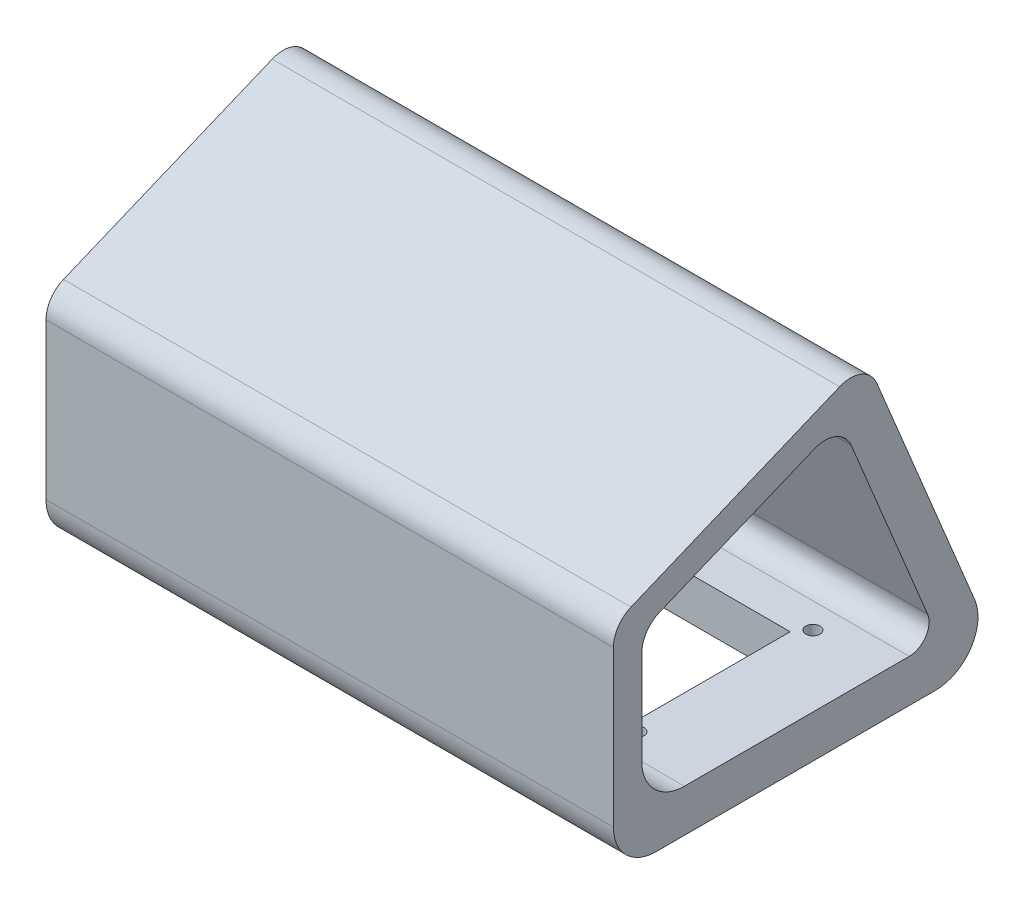
ISO-10303-21;
HEADER;
FILE_DESCRIPTION(('STEP AP214'),'2;1');
FILE_NAME('part.step','',(''),(''),'','','');
FILE_SCHEMA(('AUTOMOTIVE_DESIGN { 1 0 10303 214 1 1 1 1 }'));
ENDSEC;
DATA;
#1=APPLICATION_CONTEXT('core data for automotive mechanical design processes');
#2=APPLICATION_PROTOCOL_DEFINITION('international standard','automotive_design',2000,#1);
#3=PRODUCT_CONTEXT('',#1,'mechanical');
#4=PRODUCT('Part','Part','',(#3));
#5=PRODUCT_RELATED_PRODUCT_CATEGORY('part','',(#4));
#6=PRODUCT_DEFINITION_FORMATION('','',#4);
#7=PRODUCT_DEFINITION_CONTEXT('part definition',#1,'design');
#8=PRODUCT_DEFINITION('design','',#6,#7);
#9=PRODUCT_DEFINITION_SHAPE('','',#8);
#10=(LENGTH_UNIT() NAMED_UNIT(*) SI_UNIT(.MILLI.,.METRE.));
#11=(NAMED_UNIT(*) PLANE_ANGLE_UNIT() SI_UNIT($,.RADIAN.));
#12=(NAMED_UNIT(*) SI_UNIT($,.STERADIAN.) SOLID_ANGLE_UNIT());
#13=UNCERTAINTY_MEASURE_WITH_UNIT(LENGTH_MEASURE(1.E-05),#10,'distance_accuracy_value','');
#14=(GEOMETRIC_REPRESENTATION_CONTEXT(3) GLOBAL_UNCERTAINTY_ASSIGNED_CONTEXT((#13)) GLOBAL_UNIT_ASSIGNED_CONTEXT((#10,
#11,#12)) REPRESENTATION_CONTEXT('',''));
#15=CARTESIAN_POINT('',(0.,0.,0.));
#16=DIRECTION('',(0.,0.,1.));
#17=DIRECTION('',(1.,0.,0.));
#18=AXIS2_PLACEMENT_3D('',#15,#16,#17);
#19=CARTESIAN_POINT('',(-37.5,7.5,15.499999988));
#20=DIRECTION('',(0.,-1.,0.));
#21=DIRECTION('',(0.,0.,1.));
#22=AXIS2_PLACEMENT_3D('',#19,#20,#21);
#23=CYLINDRICAL_SURFACE('',#22,1.2499975);
#24=CARTESIAN_POINT('',(-37.5,7.5,15.499999988));
#25=DIRECTION('',(0.,-1.,0.));
#26=DIRECTION('',(0.,0.,-1.));
#27=AXIS2_PLACEMENT_3D('',#24,#25,#26);
#28=CIRCLE('',#27,1.2499975);
#29=CARTESIAN_POINT('',(-37.5,7.5,14.250002488));
#30=VERTEX_POINT('',#29);
#31=EDGE_CURVE('E239',#30,#30,#28,.T.);
#32=ORIENTED_EDGE('',*,*,#31,.F.);
#33=EDGE_LOOP('',(#32));
#34=FACE_BOUND('',#33,.T.);
#35=CARTESIAN_POINT('',(-37.5,0.,15.499999988));
#36=DIRECTION('',(0.,-1.,0.));
#37=DIRECTION('',(0.,0.,-1.));
#38=AXIS2_PLACEMENT_3D('',#35,#36,#37);
#39=CIRCLE('',#38,1.2499975);
#40=CARTESIAN_POINT('',(-37.5,0.,14.250002488));
#41=VERTEX_POINT('',#40);
#42=EDGE_CURVE('E242',#41,#41,#39,.T.);
#43=ORIENTED_EDGE('',*,*,#42,.T.);
#44=EDGE_LOOP('',(#43));
#45=FACE_BOUND('',#44,.T.);
#46=ADVANCED_FACE('F34',(#34,#45),#23,.F.);
#47=CARTESIAN_POINT('',(37.5,7.5,15.499999988));
#48=DIRECTION('',(0.,-1.,0.));
#49=DIRECTION('',(0.,0.,1.));
#50=AXIS2_PLACEMENT_3D('',#47,#48,#49);
#51=CYLINDRICAL_SURFACE('',#50,1.2499975);
#52=CARTESIAN_POINT('',(37.5,7.5,15.499999988));
#53=DIRECTION('',(0.,1.,0.));
#54=DIRECTION('',(0.,0.,-1.));
#55=AXIS2_PLACEMENT_3D('',#52,#53,#54);
#56=CIRCLE('',#55,1.2499975);
#57=CARTESIAN_POINT('',(37.5,7.5,14.250002488));
#58=VERTEX_POINT('',#57);
#59=EDGE_CURVE('E233',#58,#58,#56,.T.);
#60=ORIENTED_EDGE('',*,*,#59,.T.);
#61=EDGE_LOOP('',(#60));
#62=FACE_BOUND('',#61,.T.);
#63=CARTESIAN_POINT('',(37.5,0.,15.499999988));
#64=DIRECTION('',(0.,1.,0.));
#65=DIRECTION('',(0.,0.,-1.));
#66=AXIS2_PLACEMENT_3D('',#63,#64,#65);
#67=CIRCLE('',#66,1.2499975);
#68=CARTESIAN_POINT('',(37.5,0.,14.250002488));
#69=VERTEX_POINT('',#68);
#70=EDGE_CURVE('E236',#69,#69,#67,.T.);
#71=ORIENTED_EDGE('',*,*,#70,.F.);
#72=EDGE_LOOP('',(#71));
#73=FACE_BOUND('',#72,.T.);
#74=ADVANCED_FACE('F385',(#62,#73),#51,.F.);
#75=CARTESIAN_POINT('',(37.5,7.5,-15.499999988));
#76=DIRECTION('',(0.,-1.,0.));
#77=DIRECTION('',(0.,0.,-1.));
#78=AXIS2_PLACEMENT_3D('',#75,#76,#77);
#79=CYLINDRICAL_SURFACE('',#78,1.2499975);
#80=CARTESIAN_POINT('',(37.5,7.5,-15.499999988));
#81=DIRECTION('',(0.,-1.,0.));
#82=DIRECTION('',(0.,0.,1.));
#83=AXIS2_PLACEMENT_3D('',#80,#81,#82);
#84=CIRCLE('',#83,1.2499975);
#85=CARTESIAN_POINT('',(37.5,7.5,-14.250002488));
#86=VERTEX_POINT('',#85);
#87=EDGE_CURVE('E224',#86,#86,#84,.T.);
#88=ORIENTED_EDGE('',*,*,#87,.F.);
#89=EDGE_LOOP('',(#88));
#90=FACE_BOUND('',#89,.T.);
#91=CARTESIAN_POINT('',(37.5,0.,-15.499999988));
#92=DIRECTION('',(0.,-1.,0.));
#93=DIRECTION('',(0.,0.,1.));
#94=AXIS2_PLACEMENT_3D('',#91,#92,#93);
#95=CIRCLE('',#94,1.2499975);
#96=CARTESIAN_POINT('',(37.5,0.,-14.250002488));
#97=VERTEX_POINT('',#96);
#98=EDGE_CURVE('E230',#97,#97,#95,.T.);
#99=ORIENTED_EDGE('',*,*,#98,.T.);
#100=EDGE_LOOP('',(#99));
#101=FACE_BOUND('',#100,.T.);
#102=ADVANCED_FACE('F391',(#90,#101),#79,.F.);
#103=CARTESIAN_POINT('',(0.,7.5,0.));
#104=DIRECTION('',(0.,1.,0.));
#105=DIRECTION('',(0.,0.,1.));
#106=AXIS2_PLACEMENT_3D('',#103,#104,#105);
#107=PLANE('',#106);
#108=DIRECTION('',(0.,0.,1.));
#109=VECTOR('',#108,1.);
#110=CARTESIAN_POINT('',(-50.,7.5,-32.717510921475));
#111=LINE('',#110,#109);
#112=CARTESIAN_POINT('',(-50.,7.5,-19.9793907521458));
#113=VERTEX_POINT('',#112);
#114=CARTESIAN_POINT('',(-50.,7.5,19.6460132044939));
#115=VERTEX_POINT('',#114);
#116=EDGE_CURVE('E220',#113,#115,#111,.T.);
#117=ORIENTED_EDGE('',*,*,#116,.T.);
#118=DIRECTION('',(1.,0.,0.));
#119=VECTOR('',#118,1.);
#120=CARTESIAN_POINT('',(50.,7.5,19.6460132044939));
#121=LINE('',#120,#119);
#122=CARTESIAN_POINT('',(50.,7.5,19.6460132044939));
#123=VERTEX_POINT('',#122);
#124=EDGE_CURVE('E265',#115,#123,#121,.T.);
#125=ORIENTED_EDGE('',*,*,#124,.T.);
#126=DIRECTION('',(0.,0.,-1.));
#127=VECTOR('',#126,1.);
#128=CARTESIAN_POINT('',(50.,7.5,-32.717510921475));
#129=LINE('',#128,#127);
#130=CARTESIAN_POINT('',(50.,7.5,-19.9793907521458));
#131=VERTEX_POINT('',#130);
#132=EDGE_CURVE('E218',#123,#131,#129,.T.);
#133=ORIENTED_EDGE('',*,*,#132,.T.);
#134=DIRECTION('',(1.,0.,0.));
#135=VECTOR('',#134,1.);
#136=CARTESIAN_POINT('',(-50.,7.5,-19.9793907521458));
#137=LINE('',#136,#135);
#138=EDGE_CURVE('E258',#131,#113,#137,.F.);
#139=ORIENTED_EDGE('',*,*,#138,.T.);
#140=EDGE_LOOP('',(#117,#125,#133,#139));
#141=FACE_BOUND('',#140,.T.);
#142=ORIENTED_EDGE('',*,*,#31,.T.);
#143=EDGE_LOOP('',(#142));
#144=FACE_BOUND('',#143,.T.);
#145=ORIENTED_EDGE('',*,*,#59,.F.);
#146=EDGE_LOOP('',(#145));
#147=FACE_BOUND('',#146,.T.);
#148=ORIENTED_EDGE('',*,*,#87,.T.);
#149=EDGE_LOOP('',(#148));
#150=FACE_BOUND('',#149,.T.);
#151=DIRECTION('',(-1.,0.,0.));
#152=VECTOR('',#151,1.);
#153=CARTESIAN_POINT('',(-35.75,7.5,-13.25));
#154=LINE('',#153,#152);
#155=CARTESIAN_POINT('',(35.75,7.5,-13.25));
#156=VERTEX_POINT('',#155);
#157=CARTESIAN_POINT('',(-35.75,7.5,-13.25));
#158=VERTEX_POINT('',#157);
#159=EDGE_CURVE('E183',#156,#158,#154,.T.);
#160=ORIENTED_EDGE('',*,*,#159,.F.);
#161=DIRECTION('',(0.,0.,-1.));
#162=VECTOR('',#161,1.);
#163=CARTESIAN_POINT('',(35.75,7.5,-13.25));
#164=LINE('',#163,#162);
#165=CARTESIAN_POINT('',(35.75,7.5,13.25));
#166=VERTEX_POINT('',#165);
#167=EDGE_CURVE('E173',#166,#156,#164,.T.);
#168=ORIENTED_EDGE('',*,*,#167,.F.);
#169=DIRECTION('',(1.,0.,0.));
#170=VECTOR('',#169,1.);
#171=CARTESIAN_POINT('',(-35.75,7.5,13.25));
#172=LINE('',#171,#170);
#173=CARTESIAN_POINT('',(-35.75,7.5,13.25));
#174=VERTEX_POINT('',#173);
#175=EDGE_CURVE('E200',#174,#166,#172,.T.);
#176=ORIENTED_EDGE('',*,*,#175,.F.);
#177=DIRECTION('',(0.,0.,1.));
#178=VECTOR('',#177,1.);
#179=CARTESIAN_POINT('',(-35.75,7.5,-13.25));
#180=LINE('',#179,#178);
#181=EDGE_CURVE('E198',#158,#174,#180,.T.);
#182=ORIENTED_EDGE('',*,*,#181,.F.);
#183=EDGE_LOOP('',(#160,#168,#176,#182));
#184=FACE_BOUND('',#183,.T.);
#185=CARTESIAN_POINT('',(-37.5,7.5,-15.499999988));
#186=DIRECTION('',(0.,1.,0.));
#187=DIRECTION('',(0.,0.,1.));
#188=AXIS2_PLACEMENT_3D('',#185,#186,#187);
#189=CIRCLE('',#188,1.2499975);
#190=CARTESIAN_POINT('',(-37.5,7.5,-14.250002488));
#191=VERTEX_POINT('',#190);
#192=EDGE_CURVE('E207',#191,#191,#189,.T.);
#193=ORIENTED_EDGE('',*,*,#192,.F.);
#194=EDGE_LOOP('',(#193));
#195=FACE_BOUND('',#194,.T.);
#196=ADVANCED_FACE('F195',(#141,#144,#147,#150,#184,#195),#107,.T.);
#197=CARTESIAN_POINT('',(0.,0.,0.));
#198=DIRECTION('',(0.,1.,0.));
#199=DIRECTION('',(0.,0.,1.));
#200=AXIS2_PLACEMENT_3D('',#197,#198,#199);
#201=PLANE('',#200);
#202=ORIENTED_EDGE('',*,*,#42,.F.);
#203=EDGE_LOOP('',(#202));
#204=FACE_BOUND('',#203,.T.);
#205=ORIENTED_EDGE('',*,*,#70,.T.);
#206=EDGE_LOOP('',(#205));
#207=FACE_BOUND('',#206,.T.);
#208=ORIENTED_EDGE('',*,*,#98,.F.);
#209=EDGE_LOOP('',(#208));
#210=FACE_BOUND('',#209,.T.);
#211=DIRECTION('',(0.,0.,-1.));
#212=VECTOR('',#211,1.);
#213=CARTESIAN_POINT('',(50.,0.,-32.717510921475));
#214=LINE('',#213,#212);
#215=CARTESIAN_POINT('',(50.,0.,24.6460132044939));
#216=VERTEX_POINT('',#215);
#217=CARTESIAN_POINT('',(50.,0.,-24.599569419282));
#218=VERTEX_POINT('',#217);
#219=EDGE_CURVE('E191',#216,#218,#214,.T.);
#220=ORIENTED_EDGE('',*,*,#219,.F.);
#221=DIRECTION('',(1.,0.,0.));
#222=VECTOR('',#221,1.);
#223=CARTESIAN_POINT('',(-50.,0.,24.6460132044939));
#224=LINE('',#223,#222);
#225=CARTESIAN_POINT('',(-50.,0.,24.6460132044939));
#226=VERTEX_POINT('',#225);
#227=EDGE_CURVE('E276',#216,#226,#224,.F.);
#228=ORIENTED_EDGE('',*,*,#227,.T.);
#229=DIRECTION('',(0.,0.,1.));
#230=VECTOR('',#229,1.);
#231=CARTESIAN_POINT('',(-50.,0.,-32.717510921475));
#232=LINE('',#231,#230);
#233=CARTESIAN_POINT('',(-50.,0.,-24.599569419282));
#234=VERTEX_POINT('',#233);
#235=EDGE_CURVE('E221',#234,#226,#232,.T.);
#236=ORIENTED_EDGE('',*,*,#235,.F.);
#237=DIRECTION('',(1.,0.,0.));
#238=VECTOR('',#237,1.);
#239=CARTESIAN_POINT('',(50.,0.,-24.599569419282));
#240=LINE('',#239,#238);
#241=EDGE_CURVE('E245',#234,#218,#240,.T.);
#242=ORIENTED_EDGE('',*,*,#241,.T.);
#243=EDGE_LOOP('',(#220,#228,#236,#242));
#244=FACE_BOUND('',#243,.T.);
#245=DIRECTION('',(0.,0.,-1.));
#246=VECTOR('',#245,1.);
#247=CARTESIAN_POINT('',(35.75,0.,-13.25));
#248=LINE('',#247,#246);
#249=CARTESIAN_POINT('',(35.75,0.,13.25));
#250=VERTEX_POINT('',#249);
#251=CARTESIAN_POINT('',(35.75,0.,-13.25));
#252=VERTEX_POINT('',#251);
#253=EDGE_CURVE('E205',#250,#252,#248,.T.);
#254=ORIENTED_EDGE('',*,*,#253,.T.);
#255=DIRECTION('',(-1.,0.,0.));
#256=VECTOR('',#255,1.);
#257=CARTESIAN_POINT('',(-35.75,0.,-13.25));
#258=LINE('',#257,#256);
#259=CARTESIAN_POINT('',(-35.75,0.,-13.25));
#260=VERTEX_POINT('',#259);
#261=EDGE_CURVE('E190',#252,#260,#258,.T.);
#262=ORIENTED_EDGE('',*,*,#261,.T.);
#263=DIRECTION('',(0.,0.,1.));
#264=VECTOR('',#263,1.);
#265=CARTESIAN_POINT('',(-35.75,0.,-13.25));
#266=LINE('',#265,#264);
#267=CARTESIAN_POINT('',(-35.75,0.,13.25));
#268=VERTEX_POINT('',#267);
#269=EDGE_CURVE('E209',#260,#268,#266,.T.);
#270=ORIENTED_EDGE('',*,*,#269,.T.);
#271=DIRECTION('',(1.,0.,0.));
#272=VECTOR('',#271,1.);
#273=CARTESIAN_POINT('',(-35.75,0.,13.25));
#274=LINE('',#273,#272);
#275=EDGE_CURVE('E184',#268,#250,#274,.T.);
#276=ORIENTED_EDGE('',*,*,#275,.T.);
#277=EDGE_LOOP('',(#254,#262,#270,#276));
#278=FACE_BOUND('',#277,.T.);
#279=CARTESIAN_POINT('',(-37.5,0.,-15.499999988));
#280=DIRECTION('',(0.,1.,0.));
#281=DIRECTION('',(0.,0.,1.));
#282=AXIS2_PLACEMENT_3D('',#279,#280,#281);
#283=CIRCLE('',#282,1.2499975);
#284=CARTESIAN_POINT('',(-37.5,0.,-14.250002488));
#285=VERTEX_POINT('',#284);
#286=EDGE_CURVE('E361',#285,#285,#283,.T.);
#287=ORIENTED_EDGE('',*,*,#286,.T.);
#288=EDGE_LOOP('',(#287));
#289=FACE_BOUND('',#288,.T.);
#290=ADVANCED_FACE('F366',(#204,#207,#210,#244,#278,#289),#201,.F.);
#291=CARTESIAN_POINT('',(50.,7.5,-32.717510921475));
#292=DIRECTION('',(-1.,0.,0.));
#293=DIRECTION('',(0.,0.,1.));
#294=AXIS2_PLACEMENT_3D('',#291,#292,#293);
#295=PLANE('',#294);
#296=DIRECTION('',(0.,0.382683432365094,-0.923879532511285));
#297=VECTOR('',#296,1.);
#298=CARTESIAN_POINT('',(50.,34.934018325252,27.1460132044939));
#299=LINE('',#298,#297);
#300=CARTESIAN_POINT('',(50.,36.2125227982119,24.0594303663194));
#301=VERTEX_POINT('',#300);
#302=CARTESIAN_POINT('',(50.,47.5162836954404,-3.23026249759205));
#303=VERTEX_POINT('',#302);
#304=EDGE_CURVE('E320',#301,#303,#299,.T.);
#305=ORIENTED_EDGE('',*,*,#304,.T.);
#306=CARTESIAN_POINT('',(50.,42.896886032884,-5.14367965941751));
#307=DIRECTION('',(-1.,0.,0.));
#308=DIRECTION('',(0.,0.,1.));
#309=AXIS2_PLACEMENT_3D('',#306,#307,#308);
#310=CIRCLE('',#309,5.);
#311=CARTESIAN_POINT('',(50.,44.8103031947095,-9.76307732197394));
#312=VERTEX_POINT('',#311);
#313=EDGE_CURVE('E311',#303,#312,#310,.T.);
#314=ORIENTED_EDGE('',*,*,#313,.T.);
#315=DIRECTION('',(0.,-0.923879532511285,-0.382683432365094));
#316=VECTOR('',#315,1.);
#317=CARTESIAN_POINT('',(50.,0.,-28.3241126392733));
#318=LINE('',#317,#316);
#319=CARTESIAN_POINT('',(50.,12.3393920132778,-23.2129691159353));
#320=VERTEX_POINT('',#319);
#321=EDGE_CURVE('E356',#312,#320,#318,.T.);
#322=ORIENTED_EDGE('',*,*,#321,.T.);
#323=CARTESIAN_POINT('',(50.,11.,-19.9793907521458));
#324=DIRECTION('',(-1.,0.,0.));
#325=DIRECTION('',(0.,0.,1.));
#326=AXIS2_PLACEMENT_3D('',#323,#324,#325);
#327=CIRCLE('',#326,3.5);
#328=EDGE_CURVE('E260',#320,#131,#327,.T.);
#329=ORIENTED_EDGE('',*,*,#328,.T.);
#330=ORIENTED_EDGE('',*,*,#132,.F.);
#331=CARTESIAN_POINT('',(50.,15.,19.6460132044939));
#332=DIRECTION('',(-1.,0.,0.));
#333=DIRECTION('',(0.,0.,1.));
#334=AXIS2_PLACEMENT_3D('',#331,#332,#333);
#335=CIRCLE('',#334,7.5);
#336=CARTESIAN_POINT('',(50.,15.,27.1460132044939));
#337=VERTEX_POINT('',#336);
#338=EDGE_CURVE('E280',#123,#337,#335,.T.);
#339=ORIENTED_EDGE('',*,*,#338,.T.);
#340=DIRECTION('',(0.,1.,0.));
#341=VECTOR('',#340,1.);
#342=CARTESIAN_POINT('',(50.,0.,27.1460132044939));
#343=LINE('',#342,#341);
#344=CARTESIAN_POINT('',(50.,31.5931251356555,27.1460132044939));
#345=VERTEX_POINT('',#344);
#346=EDGE_CURVE('E322',#337,#345,#343,.T.);
#347=ORIENTED_EDGE('',*,*,#346,.T.);
#348=CARTESIAN_POINT('',(50.,31.5931251356555,22.1460132044939));
#349=DIRECTION('',(-1.,0.,0.));
#350=DIRECTION('',(0.,0.,1.));
#351=AXIS2_PLACEMENT_3D('',#348,#349,#350);
#352=CIRCLE('',#351,5.);
#353=EDGE_CURVE('E42',#345,#301,#352,.T.);
#354=ORIENTED_EDGE('',*,*,#353,.T.);
#355=EDGE_LOOP('',(#305,#314,#322,#329,#330,#339,#347,#354));
#356=FACE_BOUND('',#355,.T.);
#357=DIRECTION('',(0.,0.923879532511285,0.382683432365094));
#358=VECTOR('',#357,1.);
#359=CARTESIAN_POINT('',(50.,7.5,-32.717510921475));
#360=LINE('',#359,#358);
#361=CARTESIAN_POINT('',(50.,10.3701257427382,-31.5286659131167));
#362=VERTEX_POINT('',#361);
#363=CARTESIAN_POINT('',(50.,52.0813512867155,-14.251310589598));
#364=VERTEX_POINT('',#363);
#365=EDGE_CURVE('E341',#362,#364,#360,.T.);
#366=ORIENTED_EDGE('',*,*,#365,.T.);
#367=CARTESIAN_POINT('',(50.,50.16793412489,-9.63191292704158));
#368=DIRECTION('',(-1.,0.,0.));
#369=DIRECTION('',(0.,0.,1.));
#370=AXIS2_PLACEMENT_3D('',#367,#368,#369);
#371=CIRCLE('',#370,5.);
#372=CARTESIAN_POINT('',(50.,54.7873317874464,-7.71849576521613));
#373=VERTEX_POINT('',#372);
#374=EDGE_CURVE('E296',#364,#373,#371,.F.);
#375=ORIENTED_EDGE('',*,*,#374,.T.);
#376=DIRECTION('',(0.,-0.382683432365094,0.923879532511285));
#377=VECTOR('',#376,1.);
#378=CARTESIAN_POINT('',(50.,38.2749115148484,32.1460132044939));
#379=LINE('',#378,#377);
#380=CARTESIAN_POINT('',(50.,39.5534159878084,29.0594303663194));
#381=VERTEX_POINT('',#380);
#382=EDGE_CURVE('E330',#373,#381,#379,.T.);
#383=ORIENTED_EDGE('',*,*,#382,.T.);
#384=CARTESIAN_POINT('',(50.,34.934018325252,27.1460132044939));
#385=DIRECTION('',(-1.,0.,0.));
#386=DIRECTION('',(0.,0.,1.));
#387=AXIS2_PLACEMENT_3D('',#384,#385,#386);
#388=CIRCLE('',#387,5.);
#389=CARTESIAN_POINT('',(50.,34.934018325252,32.1460132044939));
#390=VERTEX_POINT('',#389);
#391=EDGE_CURVE('E294',#381,#390,#388,.F.);
#392=ORIENTED_EDGE('',*,*,#391,.T.);
#393=DIRECTION('',(0.,-1.,0.));
#394=VECTOR('',#393,1.);
#395=CARTESIAN_POINT('',(50.,0.,32.1460132044939));
#396=LINE('',#395,#394);
#397=CARTESIAN_POINT('',(50.,7.5,32.1460132044939));
#398=VERTEX_POINT('',#397);
#399=EDGE_CURVE('E350',#390,#398,#396,.T.);
#400=ORIENTED_EDGE('',*,*,#399,.T.);
#401=CARTESIAN_POINT('',(50.,7.5,24.6460132044939));
#402=DIRECTION('',(-1.,0.,0.));
#403=DIRECTION('',(0.,0.,1.));
#404=AXIS2_PLACEMENT_3D('',#401,#402,#403);
#405=CIRCLE('',#404,7.5);
#406=EDGE_CURVE('E274',#398,#216,#405,.F.);
#407=ORIENTED_EDGE('',*,*,#406,.T.);
#408=ORIENTED_EDGE('',*,*,#219,.T.);
#409=CARTESIAN_POINT('',(50.,7.5,-24.599569419282));
#410=DIRECTION('',(-1.,0.,0.));
#411=DIRECTION('',(0.,0.,1.));
#412=AXIS2_PLACEMENT_3D('',#409,#410,#411);
#413=CIRCLE('',#412,7.5);
#414=EDGE_CURVE('E248',#218,#362,#413,.F.);
#415=ORIENTED_EDGE('',*,*,#414,.T.);
#416=EDGE_LOOP('',(#366,#375,#383,#392,#400,#407,#408,#415));
#417=FACE_BOUND('',#416,.T.);
#418=ADVANCED_FACE('F318',(#356,#417),#295,.F.);
#419=CARTESIAN_POINT('',(-50.,7.5,-32.717510921475));
#420=DIRECTION('',(1.,0.,0.));
#421=DIRECTION('',(0.,0.,-1.));
#422=AXIS2_PLACEMENT_3D('',#419,#420,#421);
#423=PLANE('',#422);
#424=DIRECTION('',(0.,0.382683432365094,-0.923879532511285));
#425=VECTOR('',#424,1.);
#426=CARTESIAN_POINT('',(-50.,38.2749115148485,32.1460132044939));
#427=LINE('',#426,#425);
#428=CARTESIAN_POINT('',(-50.,39.5534159878084,29.0594303663194));
#429=VERTEX_POINT('',#428);
#430=CARTESIAN_POINT('',(-50.,54.7873317874464,-7.71849576521613));
#431=VERTEX_POINT('',#430);
#432=EDGE_CURVE('E343',#429,#431,#427,.T.);
#433=ORIENTED_EDGE('',*,*,#432,.T.);
#434=CARTESIAN_POINT('',(-50.,50.16793412489,-9.63191292704158));
#435=DIRECTION('',(1.,0.,0.));
#436=DIRECTION('',(0.,0.,-1.));
#437=AXIS2_PLACEMENT_3D('',#434,#435,#436);
#438=CIRCLE('',#437,5.);
#439=CARTESIAN_POINT('',(-50.,52.0813512867155,-14.251310589598));
#440=VERTEX_POINT('',#439);
#441=EDGE_CURVE('E305',#431,#440,#438,.F.);
#442=ORIENTED_EDGE('',*,*,#441,.T.);
#443=DIRECTION('',(0.,-0.923879532511285,-0.382683432365094));
#444=VECTOR('',#443,1.);
#445=CARTESIAN_POINT('',(-50.,7.5,-32.717510921475));
#446=LINE('',#445,#444);
#447=CARTESIAN_POINT('',(-50.,10.3701257427382,-31.5286659131167));
#448=VERTEX_POINT('',#447);
#449=EDGE_CURVE('E355',#440,#448,#446,.T.);
#450=ORIENTED_EDGE('',*,*,#449,.T.);
#451=CARTESIAN_POINT('',(-50.,7.5,-24.599569419282));
#452=DIRECTION('',(1.,0.,0.));
#453=DIRECTION('',(0.,0.,-1.));
#454=AXIS2_PLACEMENT_3D('',#451,#452,#453);
#455=CIRCLE('',#454,7.5);
#456=EDGE_CURVE('E253',#448,#234,#455,.F.);
#457=ORIENTED_EDGE('',*,*,#456,.T.);
#458=ORIENTED_EDGE('',*,*,#235,.T.);
#459=CARTESIAN_POINT('',(-50.,7.5,24.6460132044939));
#460=DIRECTION('',(1.,0.,0.));
#461=DIRECTION('',(0.,0.,-1.));
#462=AXIS2_PLACEMENT_3D('',#459,#460,#461);
#463=CIRCLE('',#462,7.5);
#464=CARTESIAN_POINT('',(-50.,7.5,32.1460132044939));
#465=VERTEX_POINT('',#464);
#466=EDGE_CURVE('E278',#226,#465,#463,.F.);
#467=ORIENTED_EDGE('',*,*,#466,.T.);
#468=DIRECTION('',(0.,1.,0.));
#469=VECTOR('',#468,1.);
#470=CARTESIAN_POINT('',(-50.,0.,32.1460132044939));
#471=LINE('',#470,#469);
#472=CARTESIAN_POINT('',(-50.,34.934018325252,32.1460132044939));
#473=VERTEX_POINT('',#472);
#474=EDGE_CURVE('E339',#465,#473,#471,.T.);
#475=ORIENTED_EDGE('',*,*,#474,.T.);
#476=CARTESIAN_POINT('',(-50.,34.934018325252,27.1460132044939));
#477=DIRECTION('',(1.,0.,0.));
#478=DIRECTION('',(0.,0.,-1.));
#479=AXIS2_PLACEMENT_3D('',#476,#477,#478);
#480=CIRCLE('',#479,5.);
#481=EDGE_CURVE('E303',#473,#429,#480,.F.);
#482=ORIENTED_EDGE('',*,*,#481,.T.);
#483=EDGE_LOOP('',(#433,#442,#450,#457,#458,#467,#475,#482));
#484=FACE_BOUND('',#483,.T.);
#485=ORIENTED_EDGE('',*,*,#116,.F.);
#486=CARTESIAN_POINT('',(-50.,11.,-19.9793907521458));
#487=DIRECTION('',(1.,0.,0.));
#488=DIRECTION('',(0.,0.,-1.));
#489=AXIS2_PLACEMENT_3D('',#486,#487,#488);
#490=CIRCLE('',#489,3.5);
#491=CARTESIAN_POINT('',(-50.,12.3393920132778,-23.2129691159353));
#492=VERTEX_POINT('',#491);
#493=EDGE_CURVE('E263',#113,#492,#490,.T.);
#494=ORIENTED_EDGE('',*,*,#493,.T.);
#495=DIRECTION('',(0.,0.923879532511285,0.382683432365094));
#496=VECTOR('',#495,1.);
#497=CARTESIAN_POINT('',(-50.,0.,-28.3241126392733));
#498=LINE('',#497,#496);
#499=CARTESIAN_POINT('',(-50.,44.8103031947095,-9.76307732197394));
#500=VERTEX_POINT('',#499);
#501=EDGE_CURVE('E352',#492,#500,#498,.T.);
#502=ORIENTED_EDGE('',*,*,#501,.T.);
#503=CARTESIAN_POINT('',(-50.,42.896886032884,-5.14367965941751));
#504=DIRECTION('',(1.,0.,0.));
#505=DIRECTION('',(0.,0.,-1.));
#506=AXIS2_PLACEMENT_3D('',#503,#504,#505);
#507=CIRCLE('',#506,5.);
#508=CARTESIAN_POINT('',(-50.,47.5162836954404,-3.23026249759206));
#509=VERTEX_POINT('',#508);
#510=EDGE_CURVE('E313',#500,#509,#507,.T.);
#511=ORIENTED_EDGE('',*,*,#510,.T.);
#512=DIRECTION('',(0.,-0.382683432365094,0.923879532511285));
#513=VECTOR('',#512,1.);
#514=CARTESIAN_POINT('',(-50.,34.934018325252,27.1460132044939));
#515=LINE('',#514,#513);
#516=CARTESIAN_POINT('',(-50.,36.2125227982119,24.0594303663194));
#517=VERTEX_POINT('',#516);
#518=EDGE_CURVE('E338',#509,#517,#515,.T.);
#519=ORIENTED_EDGE('',*,*,#518,.T.);
#520=CARTESIAN_POINT('',(-50.,31.5931251356555,22.1460132044939));
#521=DIRECTION('',(1.,0.,0.));
#522=DIRECTION('',(0.,0.,-1.));
#523=AXIS2_PLACEMENT_3D('',#520,#521,#522);
#524=CIRCLE('',#523,5.);
#525=CARTESIAN_POINT('',(-50.,31.5931251356555,27.1460132044939));
#526=VERTEX_POINT('',#525);
#527=EDGE_CURVE('E11',#517,#526,#524,.T.);
#528=ORIENTED_EDGE('',*,*,#527,.T.);
#529=DIRECTION('',(0.,-1.,0.));
#530=VECTOR('',#529,1.);
#531=CARTESIAN_POINT('',(-50.,0.,27.1460132044939));
#532=LINE('',#531,#530);
#533=CARTESIAN_POINT('',(-50.,15.,27.1460132044939));
#534=VERTEX_POINT('',#533);
#535=EDGE_CURVE('E336',#526,#534,#532,.T.);
#536=ORIENTED_EDGE('',*,*,#535,.T.);
#537=CARTESIAN_POINT('',(-50.,15.,19.6460132044939));
#538=DIRECTION('',(1.,0.,0.));
#539=DIRECTION('',(0.,0.,-1.));
#540=AXIS2_PLACEMENT_3D('',#537,#538,#539);
#541=CIRCLE('',#540,7.5);
#542=EDGE_CURVE('E282',#534,#115,#541,.T.);
#543=ORIENTED_EDGE('',*,*,#542,.T.);
#544=EDGE_LOOP('',(#485,#494,#502,#511,#519,#528,#536,#543));
#545=FACE_BOUND('',#544,.T.);
#546=ADVANCED_FACE('F433',(#484,#545),#423,.F.);
#547=CARTESIAN_POINT('',(35.75,7.5,-13.25));
#548=DIRECTION('',(-1.,0.,0.));
#549=DIRECTION('',(0.,0.,1.));
#550=AXIS2_PLACEMENT_3D('',#547,#548,#549);
#551=PLANE('',#550);
#552=ORIENTED_EDGE('',*,*,#253,.F.);
#553=DIRECTION('',(0.,-1.,0.));
#554=VECTOR('',#553,1.);
#555=CARTESIAN_POINT('',(35.75,7.5,13.25));
#556=LINE('',#555,#554);
#557=EDGE_CURVE('E179',#166,#250,#556,.T.);
#558=ORIENTED_EDGE('',*,*,#557,.F.);
#559=ORIENTED_EDGE('',*,*,#167,.T.);
#560=DIRECTION('',(0.,-1.,0.));
#561=VECTOR('',#560,1.);
#562=CARTESIAN_POINT('',(35.75,7.5,-13.25));
#563=LINE('',#562,#561);
#564=EDGE_CURVE('E176',#156,#252,#563,.T.);
#565=ORIENTED_EDGE('',*,*,#564,.T.);
#566=EDGE_LOOP('',(#552,#558,#559,#565));
#567=FACE_BOUND('',#566,.T.);
#568=ADVANCED_FACE('F175',(#567),#551,.T.);
#569=CARTESIAN_POINT('',(-35.75,7.5,-13.25));
#570=DIRECTION('',(0.,0.,1.));
#571=DIRECTION('',(1.,0.,0.));
#572=AXIS2_PLACEMENT_3D('',#569,#570,#571);
#573=PLANE('',#572);
#574=ORIENTED_EDGE('',*,*,#261,.F.);
#575=ORIENTED_EDGE('',*,*,#564,.F.);
#576=ORIENTED_EDGE('',*,*,#159,.T.);
#577=DIRECTION('',(0.,-1.,0.));
#578=VECTOR('',#577,1.);
#579=CARTESIAN_POINT('',(-35.75,7.5,-13.25));
#580=LINE('',#579,#578);
#581=EDGE_CURVE('E192',#158,#260,#580,.T.);
#582=ORIENTED_EDGE('',*,*,#581,.T.);
#583=EDGE_LOOP('',(#574,#575,#576,#582));
#584=FACE_BOUND('',#583,.T.);
#585=ADVANCED_FACE('F187',(#584),#573,.T.);
#586=CARTESIAN_POINT('',(-35.75,7.5,-13.25));
#587=DIRECTION('',(1.,0.,0.));
#588=DIRECTION('',(0.,0.,-1.));
#589=AXIS2_PLACEMENT_3D('',#586,#587,#588);
#590=PLANE('',#589);
#591=ORIENTED_EDGE('',*,*,#269,.F.);
#592=ORIENTED_EDGE('',*,*,#581,.F.);
#593=ORIENTED_EDGE('',*,*,#181,.T.);
#594=DIRECTION('',(0.,-1.,0.));
#595=VECTOR('',#594,1.);
#596=CARTESIAN_POINT('',(-35.75,7.5,13.25));
#597=LINE('',#596,#595);
#598=EDGE_CURVE('E215',#174,#268,#597,.T.);
#599=ORIENTED_EDGE('',*,*,#598,.T.);
#600=EDGE_LOOP('',(#591,#592,#593,#599));
#601=FACE_BOUND('',#600,.T.);
#602=ADVANCED_FACE('F381',(#601),#590,.T.);
#603=CARTESIAN_POINT('',(-35.75,7.5,13.25));
#604=DIRECTION('',(0.,0.,-1.));
#605=DIRECTION('',(-1.,0.,0.));
#606=AXIS2_PLACEMENT_3D('',#603,#604,#605);
#607=PLANE('',#606);
#608=ORIENTED_EDGE('',*,*,#275,.F.);
#609=ORIENTED_EDGE('',*,*,#598,.F.);
#610=ORIENTED_EDGE('',*,*,#175,.T.);
#611=ORIENTED_EDGE('',*,*,#557,.T.);
#612=EDGE_LOOP('',(#608,#609,#610,#611));
#613=FACE_BOUND('',#612,.T.);
#614=ADVANCED_FACE('F371',(#613),#607,.T.);
#615=CARTESIAN_POINT('',(-37.5,7.5,-15.499999988));
#616=DIRECTION('',(0.,-1.,0.));
#617=DIRECTION('',(0.,0.,-1.));
#618=AXIS2_PLACEMENT_3D('',#615,#616,#617);
#619=CYLINDRICAL_SURFACE('',#618,1.2499975);
#620=ORIENTED_EDGE('',*,*,#192,.T.);
#621=EDGE_LOOP('',(#620));
#622=FACE_BOUND('',#621,.T.);
#623=ORIENTED_EDGE('',*,*,#286,.F.);
#624=EDGE_LOOP('',(#623));
#625=FACE_BOUND('',#624,.T.);
#626=ADVANCED_FACE('F368',(#622,#625),#619,.F.);
#627=CARTESIAN_POINT('',(-104.723683025709,7.5,-32.717510921475));
#628=DIRECTION('',(0.,0.382683432365094,-0.923879532511285));
#629=DIRECTION('',(0.,0.923879532511285,0.382683432365094));
#630=AXIS2_PLACEMENT_3D('',#627,#628,#629);
#631=PLANE('',#630);
#632=ORIENTED_EDGE('',*,*,#449,.F.);
#633=DIRECTION('',(1.,0.,0.));
#634=VECTOR('',#633,1.);
#635=CARTESIAN_POINT('',(-104.723683025709,52.0813512867155,-14.251310589598));
#636=LINE('',#635,#634);
#637=EDGE_CURVE('E291',#440,#364,#636,.T.);
#638=ORIENTED_EDGE('',*,*,#637,.T.);
#639=ORIENTED_EDGE('',*,*,#365,.F.);
#640=DIRECTION('',(1.,0.,0.));
#641=VECTOR('',#640,1.);
#642=CARTESIAN_POINT('',(-50.,10.3701257427382,-31.5286659131167));
#643=LINE('',#642,#641);
#644=EDGE_CURVE('E250',#362,#448,#643,.F.);
#645=ORIENTED_EDGE('',*,*,#644,.T.);
#646=EDGE_LOOP('',(#632,#638,#639,#645));
#647=FACE_BOUND('',#646,.T.);
#648=ADVANCED_FACE('F370',(#647),#631,.T.);
#649=CARTESIAN_POINT('',(-104.723683025709,0.,-28.3241126392733));
#650=DIRECTION('',(0.,-0.382683432365094,0.923879532511285));
#651=DIRECTION('',(0.,-0.923879532511285,-0.382683432365094));
#652=AXIS2_PLACEMENT_3D('',#649,#650,#651);
#653=PLANE('',#652);
#654=ORIENTED_EDGE('',*,*,#321,.F.);
#655=DIRECTION('',(1.,0.,0.));
#656=VECTOR('',#655,1.);
#657=CARTESIAN_POINT('',(-50.,44.8103031947095,-9.76307732197395));
#658=LINE('',#657,#656);
#659=EDGE_CURVE('E289',#312,#500,#658,.F.);
#660=ORIENTED_EDGE('',*,*,#659,.T.);
#661=ORIENTED_EDGE('',*,*,#501,.F.);
#662=DIRECTION('',(1.,0.,0.));
#663=VECTOR('',#662,1.);
#664=CARTESIAN_POINT('',(50.,12.3393920132778,-23.2129691159353));
#665=LINE('',#664,#663);
#666=EDGE_CURVE('E255',#492,#320,#665,.T.);
#667=ORIENTED_EDGE('',*,*,#666,.T.);
#668=EDGE_LOOP('',(#654,#660,#661,#667));
#669=FACE_BOUND('',#668,.T.);
#670=ADVANCED_FACE('F378',(#669),#653,.T.);
#671=CARTESIAN_POINT('',(0.,7.5,-24.599569419282));
#672=DIRECTION('',(-1.,0.,0.));
#673=DIRECTION('',(0.,0.,1.));
#674=AXIS2_PLACEMENT_3D('',#671,#672,#673);
#675=CYLINDRICAL_SURFACE('',#674,7.5);
#676=ORIENTED_EDGE('',*,*,#456,.F.);
#677=ORIENTED_EDGE('',*,*,#644,.F.);
#678=ORIENTED_EDGE('',*,*,#414,.F.);
#679=ORIENTED_EDGE('',*,*,#241,.F.);
#680=EDGE_LOOP('',(#676,#677,#678,#679));
#681=FACE_BOUND('',#680,.T.);
#682=ADVANCED_FACE('F398',(#681),#675,.T.);
#683=CARTESIAN_POINT('',(-124.480867218625,0.,27.1460132044939));
#684=DIRECTION('',(0.,0.,-1.));
#685=DIRECTION('',(-1.,0.,0.));
#686=AXIS2_PLACEMENT_3D('',#683,#684,#685);
#687=PLANE('',#686);
#688=ORIENTED_EDGE('',*,*,#535,.F.);
#689=DIRECTION('',(1.,0.,0.));
#690=VECTOR('',#689,1.);
#691=CARTESIAN_POINT('',(50.,31.5931251356555,27.1460132044939));
#692=LINE('',#691,#690);
#693=EDGE_CURVE('E307',#526,#345,#692,.T.);
#694=ORIENTED_EDGE('',*,*,#693,.T.);
#695=ORIENTED_EDGE('',*,*,#346,.F.);
#696=DIRECTION('',(1.,0.,0.));
#697=VECTOR('',#696,1.);
#698=CARTESIAN_POINT('',(-50.,15.,27.1460132044939));
#699=LINE('',#698,#697);
#700=EDGE_CURVE('E268',#337,#534,#699,.F.);
#701=ORIENTED_EDGE('',*,*,#700,.T.);
#702=EDGE_LOOP('',(#688,#694,#695,#701));
#703=FACE_BOUND('',#702,.T.);
#704=ADVANCED_FACE('F334',(#703),#687,.T.);
#705=CARTESIAN_POINT('',(-124.480867218625,0.,32.1460132044939));
#706=DIRECTION('',(0.,0.,1.));
#707=DIRECTION('',(1.,0.,0.));
#708=AXIS2_PLACEMENT_3D('',#705,#706,#707);
#709=PLANE('',#708);
#710=ORIENTED_EDGE('',*,*,#399,.F.);
#711=DIRECTION('',(1.,0.,0.));
#712=VECTOR('',#711,1.);
#713=CARTESIAN_POINT('',(-124.480867218625,34.934018325252,32.1460132044939));
#714=LINE('',#713,#712);
#715=EDGE_CURVE('E55',#390,#473,#714,.F.);
#716=ORIENTED_EDGE('',*,*,#715,.T.);
#717=ORIENTED_EDGE('',*,*,#474,.F.);
#718=DIRECTION('',(1.,0.,0.));
#719=VECTOR('',#718,1.);
#720=CARTESIAN_POINT('',(50.,7.5,32.1460132044939));
#721=LINE('',#720,#719);
#722=EDGE_CURVE('E271',#465,#398,#721,.T.);
#723=ORIENTED_EDGE('',*,*,#722,.T.);
#724=EDGE_LOOP('',(#710,#716,#717,#723));
#725=FACE_BOUND('',#724,.T.);
#726=ADVANCED_FACE('F454',(#725),#709,.T.);
#727=CARTESIAN_POINT('',(-124.480867218625,38.2749115148484,32.1460132044939));
#728=DIRECTION('',(0.,0.923879532511285,0.382683432365094));
#729=DIRECTION('',(0.,-0.382683432365094,0.923879532511285));
#730=AXIS2_PLACEMENT_3D('',#727,#728,#729);
#731=PLANE('',#730);
#732=ORIENTED_EDGE('',*,*,#382,.F.);
#733=DIRECTION('',(1.,0.,0.));
#734=VECTOR('',#733,1.);
#735=CARTESIAN_POINT('',(-124.480867218625,54.7873317874464,-7.71849576521613));
#736=LINE('',#735,#734);
#737=EDGE_CURVE('E301',#373,#431,#736,.F.);
#738=ORIENTED_EDGE('',*,*,#737,.T.);
#739=ORIENTED_EDGE('',*,*,#432,.F.);
#740=DIRECTION('',(1.,0.,0.));
#741=VECTOR('',#740,1.);
#742=CARTESIAN_POINT('',(-124.480867218625,39.5534159878084,29.0594303663194));
#743=LINE('',#742,#741);
#744=EDGE_CURVE('E298',#429,#381,#743,.T.);
#745=ORIENTED_EDGE('',*,*,#744,.T.);
#746=EDGE_LOOP('',(#732,#738,#739,#745));
#747=FACE_BOUND('',#746,.T.);
#748=ADVANCED_FACE('F437',(#747),#731,.T.);
#749=CARTESIAN_POINT('',(-124.480867218625,34.934018325252,27.1460132044939));
#750=DIRECTION('',(0.,-0.923879532511285,-0.382683432365094));
#751=DIRECTION('',(0.,0.382683432365094,-0.923879532511285));
#752=AXIS2_PLACEMENT_3D('',#749,#750,#751);
#753=PLANE('',#752);
#754=ORIENTED_EDGE('',*,*,#518,.F.);
#755=DIRECTION('',(1.,0.,0.));
#756=VECTOR('',#755,1.);
#757=CARTESIAN_POINT('',(50.,47.5162836954404,-3.23026249759205));
#758=LINE('',#757,#756);
#759=EDGE_CURVE('E286',#509,#303,#758,.T.);
#760=ORIENTED_EDGE('',*,*,#759,.T.);
#761=ORIENTED_EDGE('',*,*,#304,.F.);
#762=DIRECTION('',(1.,0.,0.));
#763=VECTOR('',#762,1.);
#764=CARTESIAN_POINT('',(-50.,36.2125227982119,24.0594303663194));
#765=LINE('',#764,#763);
#766=EDGE_CURVE('E284',#301,#517,#765,.F.);
#767=ORIENTED_EDGE('',*,*,#766,.T.);
#768=EDGE_LOOP('',(#754,#760,#761,#767));
#769=FACE_BOUND('',#768,.T.);
#770=ADVANCED_FACE('F328',(#769),#753,.T.);
#771=CARTESIAN_POINT('',(-104.723683025709,11.,-19.9793907521458));
#772=DIRECTION('',(-1.,0.,0.));
#773=DIRECTION('',(0.,0.,1.));
#774=AXIS2_PLACEMENT_3D('',#771,#772,#773);
#775=CYLINDRICAL_SURFACE('',#774,3.5);
#776=ORIENTED_EDGE('',*,*,#493,.F.);
#777=ORIENTED_EDGE('',*,*,#138,.F.);
#778=ORIENTED_EDGE('',*,*,#328,.F.);
#779=ORIENTED_EDGE('',*,*,#666,.F.);
#780=EDGE_LOOP('',(#776,#777,#778,#779));
#781=FACE_BOUND('',#780,.T.);
#782=ADVANCED_FACE('F402',(#781),#775,.F.);
#783=CARTESIAN_POINT('',(0.,15.,19.6460132044939));
#784=DIRECTION('',(-1.,0.,0.));
#785=DIRECTION('',(0.,0.,1.));
#786=AXIS2_PLACEMENT_3D('',#783,#784,#785);
#787=CYLINDRICAL_SURFACE('',#786,7.5);
#788=ORIENTED_EDGE('',*,*,#542,.F.);
#789=ORIENTED_EDGE('',*,*,#700,.F.);
#790=ORIENTED_EDGE('',*,*,#338,.F.);
#791=ORIENTED_EDGE('',*,*,#124,.F.);
#792=EDGE_LOOP('',(#788,#789,#790,#791));
#793=FACE_BOUND('',#792,.T.);
#794=ADVANCED_FACE('F405',(#793),#787,.F.);
#795=CARTESIAN_POINT('',(-124.480867218625,7.5,24.6460132044939));
#796=DIRECTION('',(-1.,0.,0.));
#797=DIRECTION('',(0.,0.,1.));
#798=AXIS2_PLACEMENT_3D('',#795,#796,#797);
#799=CYLINDRICAL_SURFACE('',#798,7.5);
#800=ORIENTED_EDGE('',*,*,#466,.F.);
#801=ORIENTED_EDGE('',*,*,#227,.F.);
#802=ORIENTED_EDGE('',*,*,#406,.F.);
#803=ORIENTED_EDGE('',*,*,#722,.F.);
#804=EDGE_LOOP('',(#800,#801,#802,#803));
#805=FACE_BOUND('',#804,.T.);
#806=ADVANCED_FACE('F409',(#805),#799,.T.);
#807=CARTESIAN_POINT('',(-124.480867218625,42.896886032884,-5.14367965941751));
#808=DIRECTION('',(-1.,0.,0.));
#809=DIRECTION('',(0.,0.,1.));
#810=AXIS2_PLACEMENT_3D('',#807,#808,#809);
#811=CYLINDRICAL_SURFACE('',#810,5.);
#812=ORIENTED_EDGE('',*,*,#510,.F.);
#813=ORIENTED_EDGE('',*,*,#659,.F.);
#814=ORIENTED_EDGE('',*,*,#313,.F.);
#815=ORIENTED_EDGE('',*,*,#759,.F.);
#816=EDGE_LOOP('',(#812,#813,#814,#815));
#817=FACE_BOUND('',#816,.T.);
#818=ADVANCED_FACE('F413',(#817),#811,.F.);
#819=CARTESIAN_POINT('',(-104.723683025709,50.16793412489,-9.63191292704158));
#820=DIRECTION('',(1.,0.,0.));
#821=DIRECTION('',(0.,0.,-1.));
#822=AXIS2_PLACEMENT_3D('',#819,#820,#821);
#823=CYLINDRICAL_SURFACE('',#822,5.);
#824=ORIENTED_EDGE('',*,*,#441,.F.);
#825=ORIENTED_EDGE('',*,*,#737,.F.);
#826=ORIENTED_EDGE('',*,*,#374,.F.);
#827=ORIENTED_EDGE('',*,*,#637,.F.);
#828=EDGE_LOOP('',(#824,#825,#826,#827));
#829=FACE_BOUND('',#828,.T.);
#830=ADVANCED_FACE('F417',(#829),#823,.T.);
#831=CARTESIAN_POINT('',(-124.480867218625,31.5931251356555,22.1460132044939));
#832=DIRECTION('',(-1.,0.,0.));
#833=DIRECTION('',(0.,0.,1.));
#834=AXIS2_PLACEMENT_3D('',#831,#832,#833);
#835=CYLINDRICAL_SURFACE('',#834,5.);
#836=ORIENTED_EDGE('',*,*,#527,.F.);
#837=ORIENTED_EDGE('',*,*,#766,.F.);
#838=ORIENTED_EDGE('',*,*,#353,.F.);
#839=ORIENTED_EDGE('',*,*,#693,.F.);
#840=EDGE_LOOP('',(#836,#837,#838,#839));
#841=FACE_BOUND('',#840,.T.);
#842=ADVANCED_FACE('F332',(#841),#835,.F.);
#843=CARTESIAN_POINT('',(-124.480867218625,34.934018325252,27.1460132044939));
#844=DIRECTION('',(1.,0.,0.));
#845=DIRECTION('',(0.,0.,-1.));
#846=AXIS2_PLACEMENT_3D('',#843,#844,#845);
#847=CYLINDRICAL_SURFACE('',#846,5.);
#848=ORIENTED_EDGE('',*,*,#481,.F.);
#849=ORIENTED_EDGE('',*,*,#715,.F.);
#850=ORIENTED_EDGE('',*,*,#391,.F.);
#851=ORIENTED_EDGE('',*,*,#744,.F.);
#852=EDGE_LOOP('',(#848,#849,#850,#851));
#853=FACE_BOUND('',#852,.T.);
#854=ADVANCED_FACE('F36',(#853),#847,.T.);
#855=CLOSED_SHELL('',(#46,#74,#102,#196,#290,#418,#546,#568,#585,#602,#614,#626,#648,#670,#682,
#704,#726,#748,#770,#782,#794,#806,#818,#830,#842,#854));
#856=MANIFOLD_SOLID_BREP('B2',#855);
#857=ADVANCED_BREP_SHAPE_REPRESENTATION('',(#18,#856),#14);
#858=SHAPE_DEFINITION_REPRESENTATION(#9,#857);
ENDSEC;
END-ISO-10303-21;
